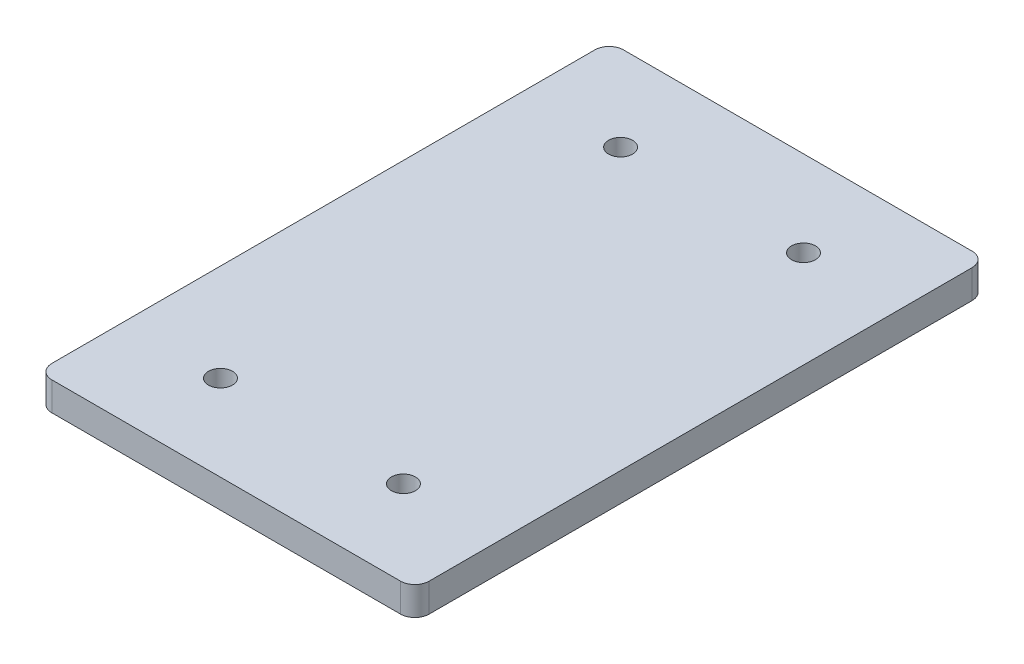
ISO-10303-21;
HEADER;
FILE_DESCRIPTION(('STEP AP214'),'2;1');
FILE_NAME('part.step','',(''),(''),'','','');
FILE_SCHEMA(('AUTOMOTIVE_DESIGN { 1 0 10303 214 1 1 1 1 }'));
ENDSEC;
DATA;
#1=APPLICATION_CONTEXT('core data for automotive mechanical design processes');
#2=APPLICATION_PROTOCOL_DEFINITION('international standard','automotive_design',2000,#1);
#3=PRODUCT_CONTEXT('',#1,'mechanical');
#4=PRODUCT('Part','Part','',(#3));
#5=PRODUCT_RELATED_PRODUCT_CATEGORY('part','',(#4));
#6=PRODUCT_DEFINITION_FORMATION('','',#4);
#7=PRODUCT_DEFINITION_CONTEXT('part definition',#1,'design');
#8=PRODUCT_DEFINITION('design','',#6,#7);
#9=PRODUCT_DEFINITION_SHAPE('','',#8);
#10=(LENGTH_UNIT() NAMED_UNIT(*) SI_UNIT(.MILLI.,.METRE.));
#11=(NAMED_UNIT(*) PLANE_ANGLE_UNIT() SI_UNIT($,.RADIAN.));
#12=(NAMED_UNIT(*) SI_UNIT($,.STERADIAN.) SOLID_ANGLE_UNIT());
#13=UNCERTAINTY_MEASURE_WITH_UNIT(LENGTH_MEASURE(1.E-05),#10,'distance_accuracy_value','');
#14=(GEOMETRIC_REPRESENTATION_CONTEXT(3) GLOBAL_UNCERTAINTY_ASSIGNED_CONTEXT((#13)) GLOBAL_UNIT_ASSIGNED_CONTEXT((#10,
#11,#12)) REPRESENTATION_CONTEXT('',''));
#15=CARTESIAN_POINT('',(0.,0.,0.));
#16=DIRECTION('',(0.,0.,1.));
#17=DIRECTION('',(1.,0.,0.));
#18=AXIS2_PLACEMENT_3D('',#15,#16,#17);
#19=CARTESIAN_POINT('',(-33.,5.,50.));
#20=DIRECTION('',(1.,0.,0.));
#21=DIRECTION('',(0.,0.,-1.));
#22=AXIS2_PLACEMENT_3D('',#19,#20,#21);
#23=PLANE('',#22);
#24=DIRECTION('',(0.,0.,1.));
#25=VECTOR('',#24,1.);
#26=CARTESIAN_POINT('',(-33.,0.,50.));
#27=LINE('',#26,#25);
#28=CARTESIAN_POINT('',(-33.,0.,-47.5));
#29=VERTEX_POINT('',#28);
#30=CARTESIAN_POINT('',(-33.,0.,47.5));
#31=VERTEX_POINT('',#30);
#32=EDGE_CURVE('E125',#29,#31,#27,.T.);
#33=ORIENTED_EDGE('',*,*,#32,.T.);
#34=DIRECTION('',(0.,-1.,0.));
#35=VECTOR('',#34,1.);
#36=CARTESIAN_POINT('',(-33.,5.,47.5));
#37=LINE('',#36,#35);
#38=CARTESIAN_POINT('',(-33.,5.,47.5));
#39=VERTEX_POINT('',#38);
#40=EDGE_CURVE('E103',#31,#39,#37,.F.);
#41=ORIENTED_EDGE('',*,*,#40,.T.);
#42=DIRECTION('',(0.,0.,1.));
#43=VECTOR('',#42,1.);
#44=CARTESIAN_POINT('',(-33.,5.,50.));
#45=LINE('',#44,#43);
#46=CARTESIAN_POINT('',(-33.,5.,-47.5));
#47=VERTEX_POINT('',#46);
#48=EDGE_CURVE('E135',#47,#39,#45,.T.);
#49=ORIENTED_EDGE('',*,*,#48,.F.);
#50=DIRECTION('',(0.,-1.,0.));
#51=VECTOR('',#50,1.);
#52=CARTESIAN_POINT('',(-33.,5.,-47.5));
#53=LINE('',#52,#51);
#54=EDGE_CURVE('E108',#47,#29,#53,.T.);
#55=ORIENTED_EDGE('',*,*,#54,.T.);
#56=EDGE_LOOP('',(#33,#41,#49,#55));
#57=FACE_BOUND('',#56,.T.);
#58=ADVANCED_FACE('F33',(#57),#23,.F.);
#59=CARTESIAN_POINT('',(33.,5.,50.));
#60=DIRECTION('',(0.,0.,-1.));
#61=DIRECTION('',(-1.,0.,0.));
#62=AXIS2_PLACEMENT_3D('',#59,#60,#61);
#63=PLANE('',#62);
#64=DIRECTION('',(1.,0.,0.));
#65=VECTOR('',#64,1.);
#66=CARTESIAN_POINT('',(33.,5.,50.));
#67=LINE('',#66,#65);
#68=CARTESIAN_POINT('',(-30.5,5.,50.));
#69=VERTEX_POINT('',#68);
#70=CARTESIAN_POINT('',(30.5,5.,50.));
#71=VERTEX_POINT('',#70);
#72=EDGE_CURVE('E118',#69,#71,#67,.T.);
#73=ORIENTED_EDGE('',*,*,#72,.F.);
#74=DIRECTION('',(0.,-1.,0.));
#75=VECTOR('',#74,1.);
#76=CARTESIAN_POINT('',(-30.5,5.,50.));
#77=LINE('',#76,#75);
#78=CARTESIAN_POINT('',(-30.5,0.,50.));
#79=VERTEX_POINT('',#78);
#80=EDGE_CURVE('E102',#69,#79,#77,.T.);
#81=ORIENTED_EDGE('',*,*,#80,.T.);
#82=DIRECTION('',(1.,0.,0.));
#83=VECTOR('',#82,1.);
#84=CARTESIAN_POINT('',(33.,0.,50.));
#85=LINE('',#84,#83);
#86=CARTESIAN_POINT('',(30.5,0.,50.));
#87=VERTEX_POINT('',#86);
#88=EDGE_CURVE('E115',#79,#87,#85,.T.);
#89=ORIENTED_EDGE('',*,*,#88,.T.);
#90=DIRECTION('',(0.,-1.,0.));
#91=VECTOR('',#90,1.);
#92=CARTESIAN_POINT('',(30.5,5.,50.));
#93=LINE('',#92,#91);
#94=EDGE_CURVE('E120',#87,#71,#93,.F.);
#95=ORIENTED_EDGE('',*,*,#94,.T.);
#96=EDGE_LOOP('',(#73,#81,#89,#95));
#97=FACE_BOUND('',#96,.T.);
#98=ADVANCED_FACE('F114',(#97),#63,.F.);
#99=CARTESIAN_POINT('',(33.,5.,50.));
#100=DIRECTION('',(-1.,0.,0.));
#101=DIRECTION('',(0.,0.,1.));
#102=AXIS2_PLACEMENT_3D('',#99,#100,#101);
#103=PLANE('',#102);
#104=DIRECTION('',(0.,0.,-1.));
#105=VECTOR('',#104,1.);
#106=CARTESIAN_POINT('',(33.,5.,50.));
#107=LINE('',#106,#105);
#108=CARTESIAN_POINT('',(33.,5.,47.5));
#109=VERTEX_POINT('',#108);
#110=CARTESIAN_POINT('',(33.,5.,-47.5));
#111=VERTEX_POINT('',#110);
#112=EDGE_CURVE('E169',#109,#111,#107,.T.);
#113=ORIENTED_EDGE('',*,*,#112,.F.);
#114=DIRECTION('',(0.,-1.,0.));
#115=VECTOR('',#114,1.);
#116=CARTESIAN_POINT('',(33.,5.,47.5));
#117=LINE('',#116,#115);
#118=CARTESIAN_POINT('',(33.,0.,47.5));
#119=VERTEX_POINT('',#118);
#120=EDGE_CURVE('E154',#109,#119,#117,.T.);
#121=ORIENTED_EDGE('',*,*,#120,.T.);
#122=DIRECTION('',(0.,0.,-1.));
#123=VECTOR('',#122,1.);
#124=CARTESIAN_POINT('',(33.,0.,50.));
#125=LINE('',#124,#123);
#126=CARTESIAN_POINT('',(33.,0.,-47.5));
#127=VERTEX_POINT('',#126);
#128=EDGE_CURVE('E124',#119,#127,#125,.T.);
#129=ORIENTED_EDGE('',*,*,#128,.T.);
#130=DIRECTION('',(0.,-1.,0.));
#131=VECTOR('',#130,1.);
#132=CARTESIAN_POINT('',(33.,5.,-47.5));
#133=LINE('',#132,#131);
#134=EDGE_CURVE('E152',#127,#111,#133,.F.);
#135=ORIENTED_EDGE('',*,*,#134,.T.);
#136=EDGE_LOOP('',(#113,#121,#129,#135));
#137=FACE_BOUND('',#136,.T.);
#138=ADVANCED_FACE('F184',(#137),#103,.F.);
#139=CARTESIAN_POINT('',(33.,5.,-50.));
#140=DIRECTION('',(0.,0.,1.));
#141=DIRECTION('',(1.,0.,0.));
#142=AXIS2_PLACEMENT_3D('',#139,#140,#141);
#143=PLANE('',#142);
#144=DIRECTION('',(-1.,0.,0.));
#145=VECTOR('',#144,1.);
#146=CARTESIAN_POINT('',(33.,0.,-50.));
#147=LINE('',#146,#145);
#148=CARTESIAN_POINT('',(30.5,0.,-50.));
#149=VERTEX_POINT('',#148);
#150=CARTESIAN_POINT('',(-30.5,0.,-50.));
#151=VERTEX_POINT('',#150);
#152=EDGE_CURVE('E128',#149,#151,#147,.T.);
#153=ORIENTED_EDGE('',*,*,#152,.T.);
#154=DIRECTION('',(0.,-1.,0.));
#155=VECTOR('',#154,1.);
#156=CARTESIAN_POINT('',(-30.5,5.,-50.));
#157=LINE('',#156,#155);
#158=CARTESIAN_POINT('',(-30.5,5.,-50.));
#159=VERTEX_POINT('',#158);
#160=EDGE_CURVE('E11',#151,#159,#157,.F.);
#161=ORIENTED_EDGE('',*,*,#160,.T.);
#162=DIRECTION('',(-1.,0.,0.));
#163=VECTOR('',#162,1.);
#164=CARTESIAN_POINT('',(33.,5.,-50.));
#165=LINE('',#164,#163);
#166=CARTESIAN_POINT('',(30.5,5.,-50.));
#167=VERTEX_POINT('',#166);
#168=EDGE_CURVE('E136',#167,#159,#165,.T.);
#169=ORIENTED_EDGE('',*,*,#168,.F.);
#170=DIRECTION('',(0.,-1.,0.));
#171=VECTOR('',#170,1.);
#172=CARTESIAN_POINT('',(30.5,5.,-50.));
#173=LINE('',#172,#171);
#174=EDGE_CURVE('E41',#167,#149,#173,.T.);
#175=ORIENTED_EDGE('',*,*,#174,.T.);
#176=EDGE_LOOP('',(#153,#161,#169,#175));
#177=FACE_BOUND('',#176,.T.);
#178=ADVANCED_FACE('F159',(#177),#143,.F.);
#179=CARTESIAN_POINT('',(0.,5.,0.));
#180=DIRECTION('',(0.,1.,0.));
#181=DIRECTION('',(0.,0.,1.));
#182=AXIS2_PLACEMENT_3D('',#179,#180,#181);
#183=PLANE('',#182);
#184=CARTESIAN_POINT('',(-16.,5.,-35.));
#185=DIRECTION('',(0.,1.,0.));
#186=DIRECTION('',(0.,0.,1.));
#187=AXIS2_PLACEMENT_3D('',#184,#185,#186);
#188=CIRCLE('',#187,2.1);
#189=CARTESIAN_POINT('',(-16.,5.,-32.9));
#190=VERTEX_POINT('',#189);
#191=EDGE_CURVE('E356',#190,#190,#188,.T.);
#192=ORIENTED_EDGE('',*,*,#191,.F.);
#193=EDGE_LOOP('',(#192));
#194=FACE_BOUND('',#193,.T.);
#195=CARTESIAN_POINT('',(16.,5.,-35.));
#196=DIRECTION('',(0.,1.,0.));
#197=DIRECTION('',(0.,0.,1.));
#198=AXIS2_PLACEMENT_3D('',#195,#196,#197);
#199=CIRCLE('',#198,2.1);
#200=CARTESIAN_POINT('',(16.,5.,-32.9));
#201=VERTEX_POINT('',#200);
#202=EDGE_CURVE('E350',#201,#201,#199,.T.);
#203=ORIENTED_EDGE('',*,*,#202,.F.);
#204=EDGE_LOOP('',(#203));
#205=FACE_BOUND('',#204,.T.);
#206=CARTESIAN_POINT('',(16.,5.,35.));
#207=DIRECTION('',(0.,1.,0.));
#208=DIRECTION('',(0.,0.,1.));
#209=AXIS2_PLACEMENT_3D('',#206,#207,#208);
#210=CIRCLE('',#209,2.1);
#211=CARTESIAN_POINT('',(16.,5.,37.1));
#212=VERTEX_POINT('',#211);
#213=EDGE_CURVE('E342',#212,#212,#210,.T.);
#214=ORIENTED_EDGE('',*,*,#213,.F.);
#215=EDGE_LOOP('',(#214));
#216=FACE_BOUND('',#215,.T.);
#217=CARTESIAN_POINT('',(-16.,5.,35.));
#218=DIRECTION('',(0.,1.,0.));
#219=DIRECTION('',(0.,0.,1.));
#220=AXIS2_PLACEMENT_3D('',#217,#218,#219);
#221=CIRCLE('',#220,2.1);
#222=CARTESIAN_POINT('',(-16.,5.,37.1));
#223=VERTEX_POINT('',#222);
#224=EDGE_CURVE('E336',#223,#223,#221,.T.);
#225=ORIENTED_EDGE('',*,*,#224,.F.);
#226=EDGE_LOOP('',(#225));
#227=FACE_BOUND('',#226,.T.);
#228=ORIENTED_EDGE('',*,*,#48,.T.);
#229=CARTESIAN_POINT('',(-30.5,5.,47.5));
#230=DIRECTION('',(0.,1.,0.));
#231=DIRECTION('',(0.,0.,1.));
#232=AXIS2_PLACEMENT_3D('',#229,#230,#231);
#233=CIRCLE('',#232,2.5);
#234=EDGE_CURVE('E150',#39,#69,#233,.T.);
#235=ORIENTED_EDGE('',*,*,#234,.T.);
#236=ORIENTED_EDGE('',*,*,#72,.T.);
#237=CARTESIAN_POINT('',(30.5,5.,47.5));
#238=DIRECTION('',(0.,1.,0.));
#239=DIRECTION('',(0.,0.,1.));
#240=AXIS2_PLACEMENT_3D('',#237,#238,#239);
#241=CIRCLE('',#240,2.5);
#242=EDGE_CURVE('E148',#71,#109,#241,.T.);
#243=ORIENTED_EDGE('',*,*,#242,.T.);
#244=ORIENTED_EDGE('',*,*,#112,.T.);
#245=CARTESIAN_POINT('',(30.5,5.,-47.5));
#246=DIRECTION('',(0.,1.,0.));
#247=DIRECTION('',(0.,0.,1.));
#248=AXIS2_PLACEMENT_3D('',#245,#246,#247);
#249=CIRCLE('',#248,2.5);
#250=EDGE_CURVE('E53',#111,#167,#249,.T.);
#251=ORIENTED_EDGE('',*,*,#250,.T.);
#252=ORIENTED_EDGE('',*,*,#168,.T.);
#253=CARTESIAN_POINT('',(-30.5,5.,-47.5));
#254=DIRECTION('',(0.,1.,0.));
#255=DIRECTION('',(0.,0.,1.));
#256=AXIS2_PLACEMENT_3D('',#253,#254,#255);
#257=CIRCLE('',#256,2.5);
#258=EDGE_CURVE('E146',#159,#47,#257,.T.);
#259=ORIENTED_EDGE('',*,*,#258,.T.);
#260=EDGE_LOOP('',(#228,#235,#236,#243,#244,#251,#252,#259));
#261=FACE_BOUND('',#260,.T.);
#262=ADVANCED_FACE('F174',(#194,#205,#216,#227,#261),#183,.T.);
#263=CARTESIAN_POINT('',(0.,0.,0.));
#264=DIRECTION('',(0.,1.,0.));
#265=DIRECTION('',(0.,0.,1.));
#266=AXIS2_PLACEMENT_3D('',#263,#264,#265);
#267=PLANE('',#266);
#268=ORIENTED_EDGE('',*,*,#88,.F.);
#269=CARTESIAN_POINT('',(-30.5,0.,47.5));
#270=DIRECTION('',(0.,1.,0.));
#271=DIRECTION('',(0.,0.,1.));
#272=AXIS2_PLACEMENT_3D('',#269,#270,#271);
#273=CIRCLE('',#272,2.5);
#274=EDGE_CURVE('E98',#79,#31,#273,.F.);
#275=ORIENTED_EDGE('',*,*,#274,.T.);
#276=ORIENTED_EDGE('',*,*,#32,.F.);
#277=CARTESIAN_POINT('',(-30.5,0.,-47.5));
#278=DIRECTION('',(0.,1.,0.));
#279=DIRECTION('',(0.,0.,1.));
#280=AXIS2_PLACEMENT_3D('',#277,#278,#279);
#281=CIRCLE('',#280,2.5);
#282=EDGE_CURVE('E139',#29,#151,#281,.F.);
#283=ORIENTED_EDGE('',*,*,#282,.T.);
#284=ORIENTED_EDGE('',*,*,#152,.F.);
#285=CARTESIAN_POINT('',(30.5,0.,-47.5));
#286=DIRECTION('',(0.,1.,0.));
#287=DIRECTION('',(0.,0.,1.));
#288=AXIS2_PLACEMENT_3D('',#285,#286,#287);
#289=CIRCLE('',#288,2.5);
#290=EDGE_CURVE('E119',#149,#127,#289,.F.);
#291=ORIENTED_EDGE('',*,*,#290,.T.);
#292=ORIENTED_EDGE('',*,*,#128,.F.);
#293=CARTESIAN_POINT('',(30.5,0.,47.5));
#294=DIRECTION('',(0.,1.,0.));
#295=DIRECTION('',(0.,0.,1.));
#296=AXIS2_PLACEMENT_3D('',#293,#294,#295);
#297=CIRCLE('',#296,2.5);
#298=EDGE_CURVE('E109',#119,#87,#297,.F.);
#299=ORIENTED_EDGE('',*,*,#298,.T.);
#300=EDGE_LOOP('',(#268,#275,#276,#283,#284,#291,#292,#299));
#301=FACE_BOUND('',#300,.T.);
#302=ADVANCED_FACE('F122',(#301),#267,.F.);
#303=CARTESIAN_POINT('',(-16.,2.,35.));
#304=DIRECTION('',(0.,-1.,0.));
#305=DIRECTION('',(0.,0.,-1.));
#306=AXIS2_PLACEMENT_3D('',#303,#304,#305);
#307=PLANE('',#306);
#308=CARTESIAN_POINT('',(-16.,2.,35.));
#309=DIRECTION('',(0.,1.,0.));
#310=DIRECTION('',(0.,0.,1.));
#311=AXIS2_PLACEMENT_3D('',#308,#309,#310);
#312=CIRCLE('',#311,2.1);
#313=CARTESIAN_POINT('',(-16.,2.,37.1));
#314=VERTEX_POINT('',#313);
#315=EDGE_CURVE('E130',#314,#314,#312,.T.);
#316=ORIENTED_EDGE('',*,*,#315,.T.);
#317=EDGE_LOOP('',(#316));
#318=FACE_BOUND('',#317,.T.);
#319=ADVANCED_FACE('F182',(#318),#307,.F.);
#320=CARTESIAN_POINT('',(-16.,5.,35.));
#321=DIRECTION('',(0.,1.,0.));
#322=DIRECTION('',(0.,0.,1.));
#323=AXIS2_PLACEMENT_3D('',#320,#321,#322);
#324=CYLINDRICAL_SURFACE('',#323,2.1);
#325=ORIENTED_EDGE('',*,*,#315,.F.);
#326=EDGE_LOOP('',(#325));
#327=FACE_BOUND('',#326,.T.);
#328=ORIENTED_EDGE('',*,*,#224,.T.);
#329=EDGE_LOOP('',(#328));
#330=FACE_BOUND('',#329,.T.);
#331=ADVANCED_FACE('F303',(#327,#330),#324,.F.);
#332=CARTESIAN_POINT('',(16.,2.,35.));
#333=DIRECTION('',(0.,-1.,0.));
#334=DIRECTION('',(0.,0.,-1.));
#335=AXIS2_PLACEMENT_3D('',#332,#333,#334);
#336=PLANE('',#335);
#337=CARTESIAN_POINT('',(16.,2.,35.));
#338=DIRECTION('',(0.,1.,0.));
#339=DIRECTION('',(0.,0.,1.));
#340=AXIS2_PLACEMENT_3D('',#337,#338,#339);
#341=CIRCLE('',#340,2.1);
#342=CARTESIAN_POINT('',(16.,2.,37.1));
#343=VERTEX_POINT('',#342);
#344=EDGE_CURVE('E338',#343,#343,#341,.T.);
#345=ORIENTED_EDGE('',*,*,#344,.T.);
#346=EDGE_LOOP('',(#345));
#347=FACE_BOUND('',#346,.T.);
#348=ADVANCED_FACE('F295',(#347),#336,.F.);
#349=CARTESIAN_POINT('',(16.,5.,35.));
#350=DIRECTION('',(0.,1.,0.));
#351=DIRECTION('',(0.,0.,1.));
#352=AXIS2_PLACEMENT_3D('',#349,#350,#351);
#353=CYLINDRICAL_SURFACE('',#352,2.1);
#354=ORIENTED_EDGE('',*,*,#344,.F.);
#355=EDGE_LOOP('',(#354));
#356=FACE_BOUND('',#355,.T.);
#357=ORIENTED_EDGE('',*,*,#213,.T.);
#358=EDGE_LOOP('',(#357));
#359=FACE_BOUND('',#358,.T.);
#360=ADVANCED_FACE('F287',(#356,#359),#353,.F.);
#361=CARTESIAN_POINT('',(16.,2.,-35.));
#362=DIRECTION('',(0.,-1.,0.));
#363=DIRECTION('',(0.,0.,-1.));
#364=AXIS2_PLACEMENT_3D('',#361,#362,#363);
#365=PLANE('',#364);
#366=CARTESIAN_POINT('',(16.,2.,-35.));
#367=DIRECTION('',(0.,1.,0.));
#368=DIRECTION('',(0.,0.,1.));
#369=AXIS2_PLACEMENT_3D('',#366,#367,#368);
#370=CIRCLE('',#369,2.1);
#371=CARTESIAN_POINT('',(16.,2.,-32.9));
#372=VERTEX_POINT('',#371);
#373=EDGE_CURVE('E347',#372,#372,#370,.T.);
#374=ORIENTED_EDGE('',*,*,#373,.T.);
#375=EDGE_LOOP('',(#374));
#376=FACE_BOUND('',#375,.T.);
#377=ADVANCED_FACE('F279',(#376),#365,.F.);
#378=CARTESIAN_POINT('',(16.,5.,-35.));
#379=DIRECTION('',(0.,1.,0.));
#380=DIRECTION('',(0.,0.,1.));
#381=AXIS2_PLACEMENT_3D('',#378,#379,#380);
#382=CYLINDRICAL_SURFACE('',#381,2.1);
#383=ORIENTED_EDGE('',*,*,#373,.F.);
#384=EDGE_LOOP('',(#383));
#385=FACE_BOUND('',#384,.T.);
#386=ORIENTED_EDGE('',*,*,#202,.T.);
#387=EDGE_LOOP('',(#386));
#388=FACE_BOUND('',#387,.T.);
#389=ADVANCED_FACE('F271',(#385,#388),#382,.F.);
#390=CARTESIAN_POINT('',(-16.,2.,-35.));
#391=DIRECTION('',(0.,-1.,0.));
#392=DIRECTION('',(0.,0.,-1.));
#393=AXIS2_PLACEMENT_3D('',#390,#391,#392);
#394=PLANE('',#393);
#395=CARTESIAN_POINT('',(-16.,2.,-35.));
#396=DIRECTION('',(0.,1.,0.));
#397=DIRECTION('',(0.,0.,1.));
#398=AXIS2_PLACEMENT_3D('',#395,#396,#397);
#399=CIRCLE('',#398,2.1);
#400=CARTESIAN_POINT('',(-16.,2.,-32.9));
#401=VERTEX_POINT('',#400);
#402=EDGE_CURVE('E353',#401,#401,#399,.T.);
#403=ORIENTED_EDGE('',*,*,#402,.T.);
#404=EDGE_LOOP('',(#403));
#405=FACE_BOUND('',#404,.T.);
#406=ADVANCED_FACE('F264',(#405),#394,.F.);
#407=CARTESIAN_POINT('',(-16.,5.,-35.));
#408=DIRECTION('',(0.,1.,0.));
#409=DIRECTION('',(0.,0.,1.));
#410=AXIS2_PLACEMENT_3D('',#407,#408,#409);
#411=CYLINDRICAL_SURFACE('',#410,2.1);
#412=ORIENTED_EDGE('',*,*,#402,.F.);
#413=EDGE_LOOP('',(#412));
#414=FACE_BOUND('',#413,.T.);
#415=ORIENTED_EDGE('',*,*,#191,.T.);
#416=EDGE_LOOP('',(#415));
#417=FACE_BOUND('',#416,.T.);
#418=ADVANCED_FACE('F200',(#414,#417),#411,.F.);
#419=CARTESIAN_POINT('',(-30.5,5.,47.5));
#420=DIRECTION('',(0.,-1.,0.));
#421=DIRECTION('',(0.,0.,-1.));
#422=AXIS2_PLACEMENT_3D('',#419,#420,#421);
#423=CYLINDRICAL_SURFACE('',#422,2.5);
#424=ORIENTED_EDGE('',*,*,#234,.F.);
#425=ORIENTED_EDGE('',*,*,#40,.F.);
#426=ORIENTED_EDGE('',*,*,#274,.F.);
#427=ORIENTED_EDGE('',*,*,#80,.F.);
#428=EDGE_LOOP('',(#424,#425,#426,#427));
#429=FACE_BOUND('',#428,.T.);
#430=ADVANCED_FACE('F101',(#429),#423,.T.);
#431=CARTESIAN_POINT('',(30.5,5.,47.5));
#432=DIRECTION('',(0.,-1.,0.));
#433=DIRECTION('',(0.,0.,-1.));
#434=AXIS2_PLACEMENT_3D('',#431,#432,#433);
#435=CYLINDRICAL_SURFACE('',#434,2.5);
#436=ORIENTED_EDGE('',*,*,#242,.F.);
#437=ORIENTED_EDGE('',*,*,#94,.F.);
#438=ORIENTED_EDGE('',*,*,#298,.F.);
#439=ORIENTED_EDGE('',*,*,#120,.F.);
#440=EDGE_LOOP('',(#436,#437,#438,#439));
#441=FACE_BOUND('',#440,.T.);
#442=ADVANCED_FACE('F199',(#441),#435,.T.);
#443=CARTESIAN_POINT('',(-30.5,5.,-47.5));
#444=DIRECTION('',(0.,-1.,0.));
#445=DIRECTION('',(0.,0.,-1.));
#446=AXIS2_PLACEMENT_3D('',#443,#444,#445);
#447=CYLINDRICAL_SURFACE('',#446,2.5);
#448=ORIENTED_EDGE('',*,*,#258,.F.);
#449=ORIENTED_EDGE('',*,*,#160,.F.);
#450=ORIENTED_EDGE('',*,*,#282,.F.);
#451=ORIENTED_EDGE('',*,*,#54,.F.);
#452=EDGE_LOOP('',(#448,#449,#450,#451));
#453=FACE_BOUND('',#452,.T.);
#454=ADVANCED_FACE('F164',(#453),#447,.T.);
#455=CARTESIAN_POINT('',(30.5,5.,-47.5));
#456=DIRECTION('',(0.,-1.,0.));
#457=DIRECTION('',(0.,0.,-1.));
#458=AXIS2_PLACEMENT_3D('',#455,#456,#457);
#459=CYLINDRICAL_SURFACE('',#458,2.5);
#460=ORIENTED_EDGE('',*,*,#250,.F.);
#461=ORIENTED_EDGE('',*,*,#134,.F.);
#462=ORIENTED_EDGE('',*,*,#290,.F.);
#463=ORIENTED_EDGE('',*,*,#174,.F.);
#464=EDGE_LOOP('',(#460,#461,#462,#463));
#465=FACE_BOUND('',#464,.T.);
#466=ADVANCED_FACE('F35',(#465),#459,.T.);
#467=CLOSED_SHELL('',(#58,#98,#138,#178,#262,#302,#319,#331,#348,#360,#377,#389,#406,#418,#430,
#442,#454,#466));
#468=MANIFOLD_SOLID_BREP('B2',#467);
#469=ADVANCED_BREP_SHAPE_REPRESENTATION('',(#18,#468),#14);
#470=SHAPE_DEFINITION_REPRESENTATION(#9,#469);
ENDSEC;
END-ISO-10303-21;
